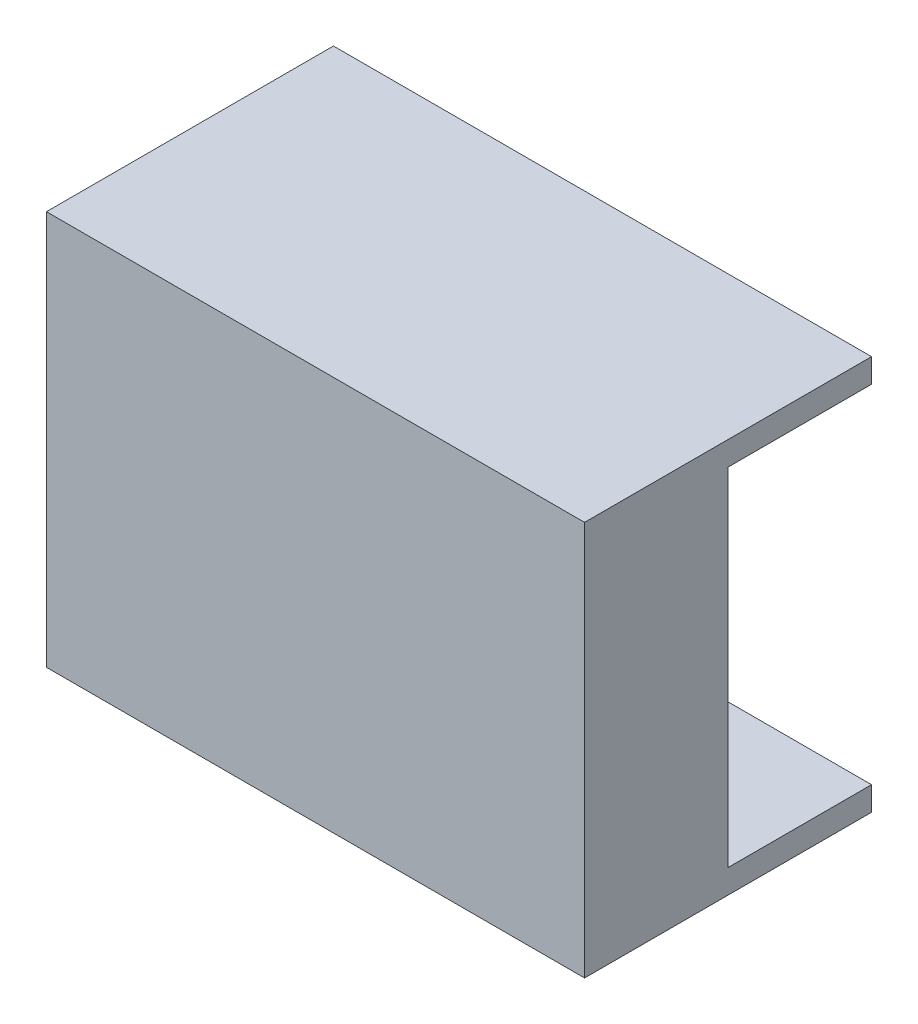
ISO-10303-21;
HEADER;
FILE_DESCRIPTION(('STEP AP214'),'2;1');
FILE_NAME('part.step','',(''),(''),'','','');
FILE_SCHEMA(('AUTOMOTIVE_DESIGN { 1 0 10303 214 1 1 1 1 }'));
ENDSEC;
DATA;
#1=APPLICATION_CONTEXT('core data for automotive mechanical design processes');
#2=APPLICATION_PROTOCOL_DEFINITION('international standard','automotive_design',2000,#1);
#3=PRODUCT_CONTEXT('',#1,'mechanical');
#4=PRODUCT('Part','Part','',(#3));
#5=PRODUCT_RELATED_PRODUCT_CATEGORY('part','',(#4));
#6=PRODUCT_DEFINITION_FORMATION('','',#4);
#7=PRODUCT_DEFINITION_CONTEXT('part definition',#1,'design');
#8=PRODUCT_DEFINITION('design','',#6,#7);
#9=PRODUCT_DEFINITION_SHAPE('','',#8);
#10=(LENGTH_UNIT() NAMED_UNIT(*) SI_UNIT(.MILLI.,.METRE.));
#11=(NAMED_UNIT(*) PLANE_ANGLE_UNIT() SI_UNIT($,.RADIAN.));
#12=(NAMED_UNIT(*) SI_UNIT($,.STERADIAN.) SOLID_ANGLE_UNIT());
#13=UNCERTAINTY_MEASURE_WITH_UNIT(LENGTH_MEASURE(1.E-05),#10,'distance_accuracy_value','');
#14=(GEOMETRIC_REPRESENTATION_CONTEXT(3) GLOBAL_UNCERTAINTY_ASSIGNED_CONTEXT((#13)) GLOBAL_UNIT_ASSIGNED_CONTEXT((#10,
#11,#12)) REPRESENTATION_CONTEXT('',''));
#15=CARTESIAN_POINT('',(0.,0.,0.));
#16=DIRECTION('',(0.,0.,1.));
#17=DIRECTION('',(1.,0.,0.));
#18=AXIS2_PLACEMENT_3D('',#15,#16,#17);
#19=CARTESIAN_POINT('',(0.,0.,24.));
#20=DIRECTION('',(0.,0.,1.));
#21=DIRECTION('',(1.,0.,0.));
#22=AXIS2_PLACEMENT_3D('',#19,#20,#21);
#23=PLANE('',#22);
#24=DIRECTION('',(-1.,0.,0.));
#25=VECTOR('',#24,1.);
#26=CARTESIAN_POINT('',(45.,-29.,24.));
#27=LINE('',#26,#25);
#28=CARTESIAN_POINT('',(45.,-29.,24.));
#29=VERTEX_POINT('',#28);
#30=CARTESIAN_POINT('',(-45.,-29.,24.));
#31=VERTEX_POINT('',#30);
#32=EDGE_CURVE('E140',#29,#31,#27,.T.);
#33=ORIENTED_EDGE('',*,*,#32,.T.);
#34=DIRECTION('',(0.,-1.,0.));
#35=VECTOR('',#34,1.);
#36=CARTESIAN_POINT('',(-45.,33.,24.));
#37=LINE('',#36,#35);
#38=CARTESIAN_POINT('',(-45.,29.,24.));
#39=VERTEX_POINT('',#38);
#40=EDGE_CURVE('E124',#39,#31,#37,.T.);
#41=ORIENTED_EDGE('',*,*,#40,.F.);
#42=DIRECTION('',(1.,0.,0.));
#43=VECTOR('',#42,1.);
#44=CARTESIAN_POINT('',(-45.,29.,24.));
#45=LINE('',#44,#43);
#46=CARTESIAN_POINT('',(45.,29.,24.));
#47=VERTEX_POINT('',#46);
#48=EDGE_CURVE('E56',#39,#47,#45,.T.);
#49=ORIENTED_EDGE('',*,*,#48,.T.);
#50=DIRECTION('',(0.,1.,0.));
#51=VECTOR('',#50,1.);
#52=CARTESIAN_POINT('',(45.,-33.,24.));
#53=LINE('',#52,#51);
#54=EDGE_CURVE('E127',#29,#47,#53,.T.);
#55=ORIENTED_EDGE('',*,*,#54,.F.);
#56=EDGE_LOOP('',(#33,#41,#49,#55));
#57=FACE_BOUND('',#56,.T.);
#58=ADVANCED_FACE('F41',(#57),#23,.F.);
#59=CARTESIAN_POINT('',(-45.,33.,24.));
#60=DIRECTION('',(1.,0.,0.));
#61=DIRECTION('',(0.,0.,-1.));
#62=AXIS2_PLACEMENT_3D('',#59,#60,#61);
#63=PLANE('',#62);
#64=DIRECTION('',(0.,-1.,0.));
#65=VECTOR('',#64,1.);
#66=CARTESIAN_POINT('',(-45.,33.,0.));
#67=LINE('',#66,#65);
#68=CARTESIAN_POINT('',(-45.,33.,0.));
#69=VERTEX_POINT('',#68);
#70=CARTESIAN_POINT('',(-45.,29.,0.));
#71=VERTEX_POINT('',#70);
#72=EDGE_CURVE('E99',#69,#71,#67,.T.);
#73=ORIENTED_EDGE('',*,*,#72,.T.);
#74=DIRECTION('',(0.,0.,-1.));
#75=VECTOR('',#74,1.);
#76=CARTESIAN_POINT('',(-45.,29.,24.));
#77=LINE('',#76,#75);
#78=EDGE_CURVE('E11',#39,#71,#77,.T.);
#79=ORIENTED_EDGE('',*,*,#78,.F.);
#80=ORIENTED_EDGE('',*,*,#40,.T.);
#81=DIRECTION('',(0.,0.,-1.));
#82=VECTOR('',#81,1.);
#83=CARTESIAN_POINT('',(-45.,-29.,24.));
#84=LINE('',#83,#82);
#85=CARTESIAN_POINT('',(-45.,-29.,0.));
#86=VERTEX_POINT('',#85);
#87=EDGE_CURVE('E146',#31,#86,#84,.T.);
#88=ORIENTED_EDGE('',*,*,#87,.T.);
#89=DIRECTION('',(0.,-1.,0.));
#90=VECTOR('',#89,1.);
#91=CARTESIAN_POINT('',(-45.,-29.,0.));
#92=LINE('',#91,#90);
#93=CARTESIAN_POINT('',(-45.,-33.,0.));
#94=VERTEX_POINT('',#93);
#95=EDGE_CURVE('E154',#86,#94,#92,.T.);
#96=ORIENTED_EDGE('',*,*,#95,.T.);
#97=DIRECTION('',(0.,0.,-1.));
#98=VECTOR('',#97,1.);
#99=CARTESIAN_POINT('',(-45.,-33.,48.));
#100=LINE('',#99,#98);
#101=CARTESIAN_POINT('',(-45.,-33.,48.));
#102=VERTEX_POINT('',#101);
#103=EDGE_CURVE('E118',#102,#94,#100,.T.);
#104=ORIENTED_EDGE('',*,*,#103,.F.);
#105=DIRECTION('',(0.,-1.,0.));
#106=VECTOR('',#105,1.);
#107=CARTESIAN_POINT('',(-45.,33.,48.));
#108=LINE('',#107,#106);
#109=CARTESIAN_POINT('',(-45.,33.,48.));
#110=VERTEX_POINT('',#109);
#111=EDGE_CURVE('E109',#110,#102,#108,.T.);
#112=ORIENTED_EDGE('',*,*,#111,.F.);
#113=DIRECTION('',(0.,0.,-1.));
#114=VECTOR('',#113,1.);
#115=CARTESIAN_POINT('',(-45.,33.,24.));
#116=LINE('',#115,#114);
#117=EDGE_CURVE('E94',#110,#69,#116,.T.);
#118=ORIENTED_EDGE('',*,*,#117,.T.);
#119=EDGE_LOOP('',(#73,#79,#80,#88,#96,#104,#112,#118));
#120=FACE_BOUND('',#119,.T.);
#121=ADVANCED_FACE('F43',(#120),#63,.F.);
#122=CARTESIAN_POINT('',(-45.,29.,24.));
#123=DIRECTION('',(0.,1.,0.));
#124=DIRECTION('',(0.,0.,1.));
#125=AXIS2_PLACEMENT_3D('',#122,#123,#124);
#126=PLANE('',#125);
#127=DIRECTION('',(1.,0.,0.));
#128=VECTOR('',#127,1.);
#129=CARTESIAN_POINT('',(-45.,29.,0.));
#130=LINE('',#129,#128);
#131=CARTESIAN_POINT('',(45.,29.,0.));
#132=VERTEX_POINT('',#131);
#133=EDGE_CURVE('E85',#71,#132,#130,.T.);
#134=ORIENTED_EDGE('',*,*,#133,.T.);
#135=DIRECTION('',(0.,0.,-1.));
#136=VECTOR('',#135,1.);
#137=CARTESIAN_POINT('',(45.,29.,24.));
#138=LINE('',#137,#136);
#139=EDGE_CURVE('E50',#47,#132,#138,.T.);
#140=ORIENTED_EDGE('',*,*,#139,.F.);
#141=ORIENTED_EDGE('',*,*,#48,.F.);
#142=ORIENTED_EDGE('',*,*,#78,.T.);
#143=EDGE_LOOP('',(#134,#140,#141,#142));
#144=FACE_BOUND('',#143,.T.);
#145=ADVANCED_FACE('F132',(#144),#126,.F.);
#146=CARTESIAN_POINT('',(45.,29.,24.));
#147=DIRECTION('',(-1.,0.,0.));
#148=DIRECTION('',(0.,0.,1.));
#149=AXIS2_PLACEMENT_3D('',#146,#147,#148);
#150=PLANE('',#149);
#151=DIRECTION('',(0.,1.,0.));
#152=VECTOR('',#151,1.);
#153=CARTESIAN_POINT('',(45.,29.,0.));
#154=LINE('',#153,#152);
#155=CARTESIAN_POINT('',(45.,33.,0.));
#156=VERTEX_POINT('',#155);
#157=EDGE_CURVE('E74',#132,#156,#154,.T.);
#158=ORIENTED_EDGE('',*,*,#157,.T.);
#159=DIRECTION('',(0.,0.,-1.));
#160=VECTOR('',#159,1.);
#161=CARTESIAN_POINT('',(45.,33.,24.));
#162=LINE('',#161,#160);
#163=CARTESIAN_POINT('',(45.,33.,48.));
#164=VERTEX_POINT('',#163);
#165=EDGE_CURVE('E79',#164,#156,#162,.T.);
#166=ORIENTED_EDGE('',*,*,#165,.F.);
#167=DIRECTION('',(0.,1.,0.));
#168=VECTOR('',#167,1.);
#169=CARTESIAN_POINT('',(45.,-33.,48.));
#170=LINE('',#169,#168);
#171=CARTESIAN_POINT('',(45.,-33.,48.));
#172=VERTEX_POINT('',#171);
#173=EDGE_CURVE('E114',#172,#164,#170,.T.);
#174=ORIENTED_EDGE('',*,*,#173,.F.);
#175=DIRECTION('',(0.,0.,-1.));
#176=VECTOR('',#175,1.);
#177=CARTESIAN_POINT('',(45.,-33.,48.));
#178=LINE('',#177,#176);
#179=CARTESIAN_POINT('',(45.,-33.,0.));
#180=VERTEX_POINT('',#179);
#181=EDGE_CURVE('E115',#172,#180,#178,.T.);
#182=ORIENTED_EDGE('',*,*,#181,.T.);
#183=DIRECTION('',(0.,1.,0.));
#184=VECTOR('',#183,1.);
#185=CARTESIAN_POINT('',(45.,-33.,0.));
#186=LINE('',#185,#184);
#187=CARTESIAN_POINT('',(45.,-29.,0.));
#188=VERTEX_POINT('',#187);
#189=EDGE_CURVE('E151',#180,#188,#186,.T.);
#190=ORIENTED_EDGE('',*,*,#189,.T.);
#191=DIRECTION('',(0.,0.,-1.));
#192=VECTOR('',#191,1.);
#193=CARTESIAN_POINT('',(45.,-29.,24.));
#194=LINE('',#193,#192);
#195=EDGE_CURVE('E128',#29,#188,#194,.T.);
#196=ORIENTED_EDGE('',*,*,#195,.F.);
#197=ORIENTED_EDGE('',*,*,#54,.T.);
#198=ORIENTED_EDGE('',*,*,#139,.T.);
#199=EDGE_LOOP('',(#158,#166,#174,#182,#190,#196,#197,#198));
#200=FACE_BOUND('',#199,.T.);
#201=ADVANCED_FACE('F76',(#200),#150,.F.);
#202=CARTESIAN_POINT('',(45.,33.,24.));
#203=DIRECTION('',(0.,-1.,0.));
#204=DIRECTION('',(0.,0.,-1.));
#205=AXIS2_PLACEMENT_3D('',#202,#203,#204);
#206=PLANE('',#205);
#207=DIRECTION('',(-1.,0.,0.));
#208=VECTOR('',#207,1.);
#209=CARTESIAN_POINT('',(45.,33.,0.));
#210=LINE('',#209,#208);
#211=EDGE_CURVE('E84',#156,#69,#210,.T.);
#212=ORIENTED_EDGE('',*,*,#211,.T.);
#213=ORIENTED_EDGE('',*,*,#117,.F.);
#214=DIRECTION('',(-1.,0.,0.));
#215=VECTOR('',#214,1.);
#216=CARTESIAN_POINT('',(45.,33.,48.));
#217=LINE('',#216,#215);
#218=EDGE_CURVE('E93',#164,#110,#217,.T.);
#219=ORIENTED_EDGE('',*,*,#218,.F.);
#220=ORIENTED_EDGE('',*,*,#165,.T.);
#221=EDGE_LOOP('',(#212,#213,#219,#220));
#222=FACE_BOUND('',#221,.T.);
#223=ADVANCED_FACE('F89',(#222),#206,.F.);
#224=CARTESIAN_POINT('',(0.,0.,0.));
#225=DIRECTION('',(0.,0.,1.));
#226=DIRECTION('',(1.,0.,0.));
#227=AXIS2_PLACEMENT_3D('',#224,#225,#226);
#228=PLANE('',#227);
#229=ORIENTED_EDGE('',*,*,#72,.F.);
#230=ORIENTED_EDGE('',*,*,#211,.F.);
#231=ORIENTED_EDGE('',*,*,#157,.F.);
#232=ORIENTED_EDGE('',*,*,#133,.F.);
#233=EDGE_LOOP('',(#229,#230,#231,#232));
#234=FACE_BOUND('',#233,.T.);
#235=ADVANCED_FACE('F97',(#234),#228,.F.);
#236=CARTESIAN_POINT('',(-45.,-33.,48.));
#237=DIRECTION('',(0.,1.,0.));
#238=DIRECTION('',(0.,0.,1.));
#239=AXIS2_PLACEMENT_3D('',#236,#237,#238);
#240=PLANE('',#239);
#241=ORIENTED_EDGE('',*,*,#103,.T.);
#242=DIRECTION('',(1.,0.,0.));
#243=VECTOR('',#242,1.);
#244=CARTESIAN_POINT('',(-45.,-33.,0.));
#245=LINE('',#244,#243);
#246=EDGE_CURVE('E157',#94,#180,#245,.T.);
#247=ORIENTED_EDGE('',*,*,#246,.T.);
#248=ORIENTED_EDGE('',*,*,#181,.F.);
#249=DIRECTION('',(1.,0.,0.));
#250=VECTOR('',#249,1.);
#251=CARTESIAN_POINT('',(-45.,-33.,48.));
#252=LINE('',#251,#250);
#253=EDGE_CURVE('E120',#102,#172,#252,.T.);
#254=ORIENTED_EDGE('',*,*,#253,.F.);
#255=EDGE_LOOP('',(#241,#247,#248,#254));
#256=FACE_BOUND('',#255,.T.);
#257=ADVANCED_FACE('F168',(#256),#240,.F.);
#258=CARTESIAN_POINT('',(0.,0.,48.));
#259=DIRECTION('',(0.,0.,1.));
#260=DIRECTION('',(1.,0.,0.));
#261=AXIS2_PLACEMENT_3D('',#258,#259,#260);
#262=PLANE('',#261);
#263=ORIENTED_EDGE('',*,*,#111,.T.);
#264=ORIENTED_EDGE('',*,*,#253,.T.);
#265=ORIENTED_EDGE('',*,*,#173,.T.);
#266=ORIENTED_EDGE('',*,*,#218,.T.);
#267=EDGE_LOOP('',(#263,#264,#265,#266));
#268=FACE_BOUND('',#267,.T.);
#269=ADVANCED_FACE('F111',(#268),#262,.T.);
#270=CARTESIAN_POINT('',(45.,-29.,24.));
#271=DIRECTION('',(0.,-1.,0.));
#272=DIRECTION('',(0.,0.,-1.));
#273=AXIS2_PLACEMENT_3D('',#270,#271,#272);
#274=PLANE('',#273);
#275=DIRECTION('',(-1.,0.,0.));
#276=VECTOR('',#275,1.);
#277=CARTESIAN_POINT('',(45.,-29.,0.));
#278=LINE('',#277,#276);
#279=EDGE_CURVE('E147',#188,#86,#278,.T.);
#280=ORIENTED_EDGE('',*,*,#279,.T.);
#281=ORIENTED_EDGE('',*,*,#87,.F.);
#282=ORIENTED_EDGE('',*,*,#32,.F.);
#283=ORIENTED_EDGE('',*,*,#195,.T.);
#284=EDGE_LOOP('',(#280,#281,#282,#283));
#285=FACE_BOUND('',#284,.T.);
#286=ADVANCED_FACE('F184',(#285),#274,.F.);
#287=CARTESIAN_POINT('',(0.,0.,0.));
#288=DIRECTION('',(0.,0.,1.));
#289=DIRECTION('',(1.,0.,0.));
#290=AXIS2_PLACEMENT_3D('',#287,#288,#289);
#291=PLANE('',#290);
#292=ORIENTED_EDGE('',*,*,#95,.F.);
#293=ORIENTED_EDGE('',*,*,#279,.F.);
#294=ORIENTED_EDGE('',*,*,#189,.F.);
#295=ORIENTED_EDGE('',*,*,#246,.F.);
#296=EDGE_LOOP('',(#292,#293,#294,#295));
#297=FACE_BOUND('',#296,.T.);
#298=ADVANCED_FACE('F187',(#297),#291,.F.);
#299=CLOSED_SHELL('',(#58,#121,#145,#201,#223,#235,#257,#269,#286,#298));
#300=MANIFOLD_SOLID_BREP('B2',#299);
#301=ADVANCED_BREP_SHAPE_REPRESENTATION('',(#18,#300),#14);
#302=SHAPE_DEFINITION_REPRESENTATION(#9,#301);
ENDSEC;
END-ISO-10303-21;
